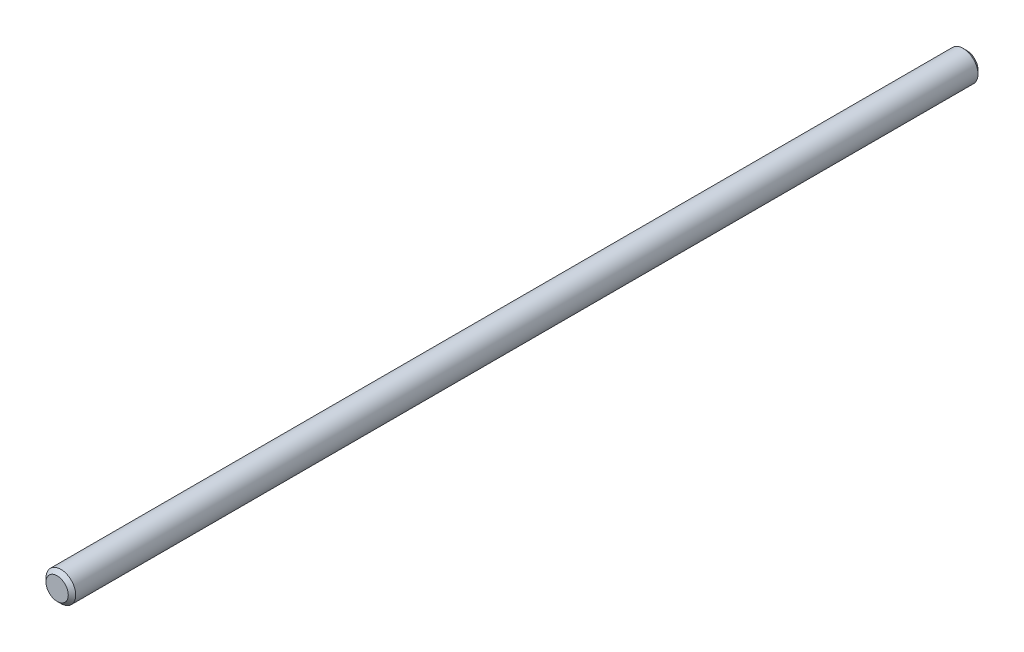
ISO-10303-21;
HEADER;
FILE_DESCRIPTION(('STEP AP214'),'2;1');
FILE_NAME('part.step','',(''),(''),'','','');
FILE_SCHEMA(('AUTOMOTIVE_DESIGN { 1 0 10303 214 1 1 1 1 }'));
ENDSEC;
DATA;
#1=APPLICATION_CONTEXT('core data for automotive mechanical design processes');
#2=APPLICATION_PROTOCOL_DEFINITION('international standard','automotive_design',2000,#1);
#3=PRODUCT_CONTEXT('',#1,'mechanical');
#4=PRODUCT('Part','Part','',(#3));
#5=PRODUCT_RELATED_PRODUCT_CATEGORY('part','',(#4));
#6=PRODUCT_DEFINITION_FORMATION('','',#4);
#7=PRODUCT_DEFINITION_CONTEXT('part definition',#1,'design');
#8=PRODUCT_DEFINITION('design','',#6,#7);
#9=PRODUCT_DEFINITION_SHAPE('','',#8);
#10=(LENGTH_UNIT() NAMED_UNIT(*) SI_UNIT(.MILLI.,.METRE.));
#11=(NAMED_UNIT(*) PLANE_ANGLE_UNIT() SI_UNIT($,.RADIAN.));
#12=(NAMED_UNIT(*) SI_UNIT($,.STERADIAN.) SOLID_ANGLE_UNIT());
#13=UNCERTAINTY_MEASURE_WITH_UNIT(LENGTH_MEASURE(1.E-05),#10,'distance_accuracy_value','');
#14=(GEOMETRIC_REPRESENTATION_CONTEXT(3) GLOBAL_UNCERTAINTY_ASSIGNED_CONTEXT((#13)) GLOBAL_UNIT_ASSIGNED_CONTEXT((#10,
#11,#12)) REPRESENTATION_CONTEXT('',''));
#15=CARTESIAN_POINT('',(0.,0.,0.));
#16=DIRECTION('',(0.,0.,1.));
#17=DIRECTION('',(1.,0.,0.));
#18=AXIS2_PLACEMENT_3D('',#15,#16,#17);
#19=CARTESIAN_POINT('',(0.,0.,245.));
#20=DIRECTION('',(0.,0.,-1.));
#21=DIRECTION('',(-1.,0.,0.));
#22=AXIS2_PLACEMENT_3D('',#19,#20,#21);
#23=CYLINDRICAL_SURFACE('',#22,4.);
#24=CARTESIAN_POINT('',(0.,0.,1.));
#25=DIRECTION('',(0.,0.,1.));
#26=DIRECTION('',(1.,0.,0.));
#27=AXIS2_PLACEMENT_3D('',#24,#25,#26);
#28=CIRCLE('',#27,4.);
#29=CARTESIAN_POINT('',(4.,0.,1.));
#30=VERTEX_POINT('',#29);
#31=EDGE_CURVE('E49',#30,#30,#28,.T.);
#32=ORIENTED_EDGE('',*,*,#31,.T.);
#33=EDGE_LOOP('',(#32));
#34=FACE_BOUND('',#33,.T.);
#35=CARTESIAN_POINT('',(0.,0.,244.));
#36=DIRECTION('',(0.,0.,1.));
#37=DIRECTION('',(1.,0.,0.));
#38=AXIS2_PLACEMENT_3D('',#35,#36,#37);
#39=CIRCLE('',#38,4.);
#40=CARTESIAN_POINT('',(4.,0.,244.));
#41=VERTEX_POINT('',#40);
#42=EDGE_CURVE('E53',#41,#41,#39,.F.);
#43=ORIENTED_EDGE('',*,*,#42,.T.);
#44=EDGE_LOOP('',(#43));
#45=FACE_BOUND('',#44,.T.);
#46=ADVANCED_FACE('F37',(#34,#45),#23,.T.);
#47=CARTESIAN_POINT('',(0.,0.,245.));
#48=DIRECTION('',(0.,0.,1.));
#49=DIRECTION('',(1.,0.,0.));
#50=AXIS2_PLACEMENT_3D('',#47,#48,#49);
#51=PLANE('',#50);
#52=CARTESIAN_POINT('',(0.,0.,245.));
#53=DIRECTION('',(0.,0.,1.));
#54=DIRECTION('',(1.,0.,0.));
#55=AXIS2_PLACEMENT_3D('',#52,#53,#54);
#56=CIRCLE('',#55,3.);
#57=CARTESIAN_POINT('',(3.,0.,245.));
#58=VERTEX_POINT('',#57);
#59=EDGE_CURVE('E10',#58,#58,#56,.T.);
#60=ORIENTED_EDGE('',*,*,#59,.T.);
#61=EDGE_LOOP('',(#60));
#62=FACE_BOUND('',#61,.T.);
#63=ADVANCED_FACE('F69',(#62),#51,.T.);
#64=CARTESIAN_POINT('',(0.,0.,0.));
#65=DIRECTION('',(0.,0.,1.));
#66=DIRECTION('',(1.,0.,0.));
#67=AXIS2_PLACEMENT_3D('',#64,#65,#66);
#68=PLANE('',#67);
#69=CARTESIAN_POINT('',(0.,0.,0.));
#70=DIRECTION('',(0.,0.,1.));
#71=DIRECTION('',(1.,0.,0.));
#72=AXIS2_PLACEMENT_3D('',#69,#70,#71);
#73=CIRCLE('',#72,2.99999999999998);
#74=CARTESIAN_POINT('',(2.99999999999998,0.,0.));
#75=VERTEX_POINT('',#74);
#76=EDGE_CURVE('E45',#75,#75,#73,.F.);
#77=ORIENTED_EDGE('',*,*,#76,.T.);
#78=EDGE_LOOP('',(#77));
#79=FACE_BOUND('',#78,.T.);
#80=ADVANCED_FACE('F66',(#79),#68,.F.);
#81=CARTESIAN_POINT('',(0.,0.,1.));
#82=DIRECTION('',(0.,0.,1.));
#83=DIRECTION('',(1.,0.,0.));
#84=AXIS2_PLACEMENT_3D('',#81,#82,#83);
#85=CONICAL_SURFACE('',#84,4.,0.78539816339746);
#86=ORIENTED_EDGE('',*,*,#76,.F.);
#87=EDGE_LOOP('',(#86));
#88=FACE_BOUND('',#87,.T.);
#89=ORIENTED_EDGE('',*,*,#31,.F.);
#90=EDGE_LOOP('',(#89));
#91=FACE_BOUND('',#90,.T.);
#92=ADVANCED_FACE('F62',(#88,#91),#85,.T.);
#93=CARTESIAN_POINT('',(0.,0.,245.));
#94=DIRECTION('',(0.,0.,-1.));
#95=DIRECTION('',(-1.,0.,0.));
#96=AXIS2_PLACEMENT_3D('',#93,#94,#95);
#97=CONICAL_SURFACE('',#96,3.,0.78539816339746);
#98=ORIENTED_EDGE('',*,*,#42,.F.);
#99=EDGE_LOOP('',(#98));
#100=FACE_BOUND('',#99,.T.);
#101=ORIENTED_EDGE('',*,*,#59,.F.);
#102=EDGE_LOOP('',(#101));
#103=FACE_BOUND('',#102,.T.);
#104=ADVANCED_FACE('F40',(#100,#103),#97,.T.);
#105=CLOSED_SHELL('',(#46,#63,#80,#92,#104));
#106=MANIFOLD_SOLID_BREP('B2',#105);
#107=ADVANCED_BREP_SHAPE_REPRESENTATION('',(#18,#106),#14);
#108=SHAPE_DEFINITION_REPRESENTATION(#9,#107);
ENDSEC;
END-ISO-10303-21;
